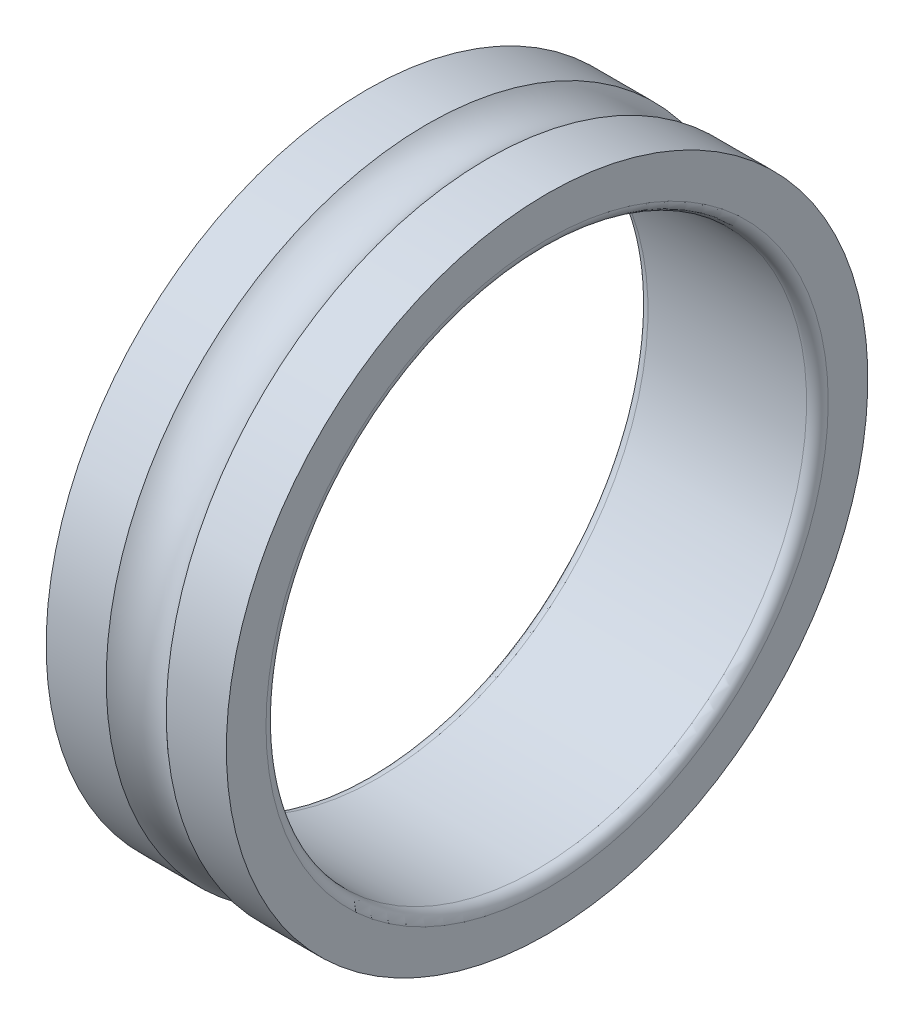
ISO-10303-21;
HEADER;
FILE_DESCRIPTION(('STEP AP214'),'2;1');
FILE_NAME('part.step','',(''),(''),'','','');
FILE_SCHEMA(('AUTOMOTIVE_DESIGN { 1 0 10303 214 1 1 1 1 }'));
ENDSEC;
DATA;
#1=APPLICATION_CONTEXT('core data for automotive mechanical design processes');
#2=APPLICATION_PROTOCOL_DEFINITION('international standard','automotive_design',2000,#1);
#3=PRODUCT_CONTEXT('',#1,'mechanical');
#4=PRODUCT('Part','Part','',(#3));
#5=PRODUCT_RELATED_PRODUCT_CATEGORY('part','',(#4));
#6=PRODUCT_DEFINITION_FORMATION('','',#4);
#7=PRODUCT_DEFINITION_CONTEXT('part definition',#1,'design');
#8=PRODUCT_DEFINITION('design','',#6,#7);
#9=PRODUCT_DEFINITION_SHAPE('','',#8);
#10=(LENGTH_UNIT() NAMED_UNIT(*) SI_UNIT(.MILLI.,.METRE.));
#11=(NAMED_UNIT(*) PLANE_ANGLE_UNIT() SI_UNIT($,.RADIAN.));
#12=(NAMED_UNIT(*) SI_UNIT($,.STERADIAN.) SOLID_ANGLE_UNIT());
#13=UNCERTAINTY_MEASURE_WITH_UNIT(LENGTH_MEASURE(1.E-05),#10,'distance_accuracy_value','');
#14=(GEOMETRIC_REPRESENTATION_CONTEXT(3) GLOBAL_UNCERTAINTY_ASSIGNED_CONTEXT((#13)) GLOBAL_UNIT_ASSIGNED_CONTEXT((#10,
#11,#12)) REPRESENTATION_CONTEXT('',''));
#15=CARTESIAN_POINT('',(0.,0.,0.));
#16=DIRECTION('',(0.,0.,1.));
#17=DIRECTION('',(1.,0.,0.));
#18=AXIS2_PLACEMENT_3D('',#15,#16,#17);
#19=CARTESIAN_POINT('',(4.16677039542175,0.,0.));
#20=DIRECTION('',(-1.,0.,0.));
#21=DIRECTION('',(0.,1.,0.));
#22=AXIS2_PLACEMENT_3D('',#19,#20,#21);
#23=CYLINDRICAL_SURFACE('',#22,8.9);
#24=CARTESIAN_POINT('',(3.3335407908435,0.,0.));
#25=DIRECTION('',(1.,0.,0.));
#26=DIRECTION('',(0.,1.,0.));
#27=AXIS2_PLACEMENT_3D('',#24,#25,#26);
#28=CIRCLE('',#27,8.9);
#29=CARTESIAN_POINT('',(3.3335407908435,8.9,0.));
#30=VERTEX_POINT('',#29);
#31=EDGE_CURVE('E11',#30,#30,#28,.T.);
#32=ORIENTED_EDGE('',*,*,#31,.T.);
#33=EDGE_LOOP('',(#32));
#34=FACE_BOUND('',#33,.T.);
#35=CARTESIAN_POINT('',(5.,0.,0.));
#36=DIRECTION('',(1.,0.,0.));
#37=DIRECTION('',(0.,1.,0.));
#38=AXIS2_PLACEMENT_3D('',#35,#36,#37);
#39=CIRCLE('',#38,8.9);
#40=CARTESIAN_POINT('',(5.,8.9,0.));
#41=VERTEX_POINT('',#40);
#42=EDGE_CURVE('E63',#41,#41,#39,.T.);
#43=ORIENTED_EDGE('',*,*,#42,.F.);
#44=EDGE_LOOP('',(#43));
#45=FACE_BOUND('',#44,.T.);
#46=ADVANCED_FACE('F16',(#34,#45),#23,.T.);
#47=CARTESIAN_POINT('',(2.5,0.,0.));
#48=DIRECTION('',(1.,0.,0.));
#49=DIRECTION('',(0.,0.,-1.));
#50=AXIS2_PLACEMENT_3D('',#47,#48,#49);
#51=TOROIDAL_SURFACE('',#50,9.75,1.1905);
#52=CARTESIAN_POINT('',(1.6664592091565,0.,0.));
#53=DIRECTION('',(1.,0.,0.));
#54=DIRECTION('',(0.,1.,0.));
#55=AXIS2_PLACEMENT_3D('',#52,#53,#54);
#56=CIRCLE('',#55,8.9);
#57=CARTESIAN_POINT('',(1.6664592091565,8.9,0.));
#58=VERTEX_POINT('',#57);
#59=EDGE_CURVE('E26',#58,#58,#56,.T.);
#60=ORIENTED_EDGE('',*,*,#59,.T.);
#61=EDGE_LOOP('',(#60));
#62=FACE_BOUND('',#61,.T.);
#63=ORIENTED_EDGE('',*,*,#31,.F.);
#64=EDGE_LOOP('',(#63));
#65=FACE_BOUND('',#64,.T.);
#66=ADVANCED_FACE('F74',(#62,#65),#51,.F.);
#67=CARTESIAN_POINT('',(0.833229604578252,0.,0.));
#68=DIRECTION('',(-1.,0.,0.));
#69=DIRECTION('',(0.,1.,0.));
#70=AXIS2_PLACEMENT_3D('',#67,#68,#69);
#71=CYLINDRICAL_SURFACE('',#70,8.9);
#72=CARTESIAN_POINT('',(0.,0.,0.));
#73=DIRECTION('',(1.,0.,0.));
#74=DIRECTION('',(0.,1.,0.));
#75=AXIS2_PLACEMENT_3D('',#72,#73,#74);
#76=CIRCLE('',#75,8.9);
#77=CARTESIAN_POINT('',(0.,8.9,0.));
#78=VERTEX_POINT('',#77);
#79=EDGE_CURVE('E45',#78,#78,#76,.T.);
#80=ORIENTED_EDGE('',*,*,#79,.T.);
#81=EDGE_LOOP('',(#80));
#82=FACE_BOUND('',#81,.T.);
#83=ORIENTED_EDGE('',*,*,#59,.F.);
#84=EDGE_LOOP('',(#83));
#85=FACE_BOUND('',#84,.T.);
#86=ADVANCED_FACE('F77',(#82,#85),#71,.T.);
#87=CARTESIAN_POINT('',(0.,8.35,0.));
#88=DIRECTION('',(-1.,0.,0.));
#89=DIRECTION('',(0.,-1.,0.));
#90=AXIS2_PLACEMENT_3D('',#87,#88,#89);
#91=PLANE('',#90);
#92=CARTESIAN_POINT('',(0.,0.,0.));
#93=DIRECTION('',(1.,0.,0.));
#94=DIRECTION('',(0.,1.,0.));
#95=AXIS2_PLACEMENT_3D('',#92,#93,#94);
#96=CIRCLE('',#95,7.8);
#97=CARTESIAN_POINT('',(0.,7.8,0.));
#98=VERTEX_POINT('',#97);
#99=EDGE_CURVE('E49',#98,#98,#96,.T.);
#100=ORIENTED_EDGE('',*,*,#99,.T.);
#101=EDGE_LOOP('',(#100));
#102=FACE_BOUND('',#101,.T.);
#103=ORIENTED_EDGE('',*,*,#79,.F.);
#104=EDGE_LOOP('',(#103));
#105=FACE_BOUND('',#104,.T.);
#106=ADVANCED_FACE('F79',(#102,#105),#91,.T.);
#107=CARTESIAN_POINT('',(0.3,0.,0.));
#108=DIRECTION('',(1.,0.,0.));
#109=DIRECTION('',(0.,0.,-1.));
#110=AXIS2_PLACEMENT_3D('',#107,#108,#109);
#111=TOROIDAL_SURFACE('',#110,7.8,0.3);
#112=CARTESIAN_POINT('',(0.3,0.,0.));
#113=DIRECTION('',(1.,0.,0.));
#114=DIRECTION('',(0.,1.,0.));
#115=AXIS2_PLACEMENT_3D('',#112,#113,#114);
#116=CIRCLE('',#115,7.5);
#117=CARTESIAN_POINT('',(0.3,7.5,0.));
#118=VERTEX_POINT('',#117);
#119=EDGE_CURVE('E54',#118,#118,#116,.T.);
#120=ORIENTED_EDGE('',*,*,#119,.T.);
#121=EDGE_LOOP('',(#120));
#122=FACE_BOUND('',#121,.T.);
#123=ORIENTED_EDGE('',*,*,#99,.F.);
#124=EDGE_LOOP('',(#123));
#125=FACE_BOUND('',#124,.T.);
#126=ADVANCED_FACE('F86',(#122,#125),#111,.T.);
#127=CARTESIAN_POINT('',(2.5,0.,0.));
#128=DIRECTION('',(-1.,0.,0.));
#129=DIRECTION('',(0.,1.,0.));
#130=AXIS2_PLACEMENT_3D('',#127,#128,#129);
#131=CYLINDRICAL_SURFACE('',#130,7.5);
#132=CARTESIAN_POINT('',(4.7,0.,0.));
#133=DIRECTION('',(1.,0.,0.));
#134=DIRECTION('',(0.,1.,0.));
#135=AXIS2_PLACEMENT_3D('',#132,#133,#134);
#136=CIRCLE('',#135,7.5);
#137=CARTESIAN_POINT('',(4.7,7.5,0.));
#138=VERTEX_POINT('',#137);
#139=EDGE_CURVE('E20',#138,#138,#136,.T.);
#140=ORIENTED_EDGE('',*,*,#139,.T.);
#141=EDGE_LOOP('',(#140));
#142=FACE_BOUND('',#141,.T.);
#143=ORIENTED_EDGE('',*,*,#119,.F.);
#144=EDGE_LOOP('',(#143));
#145=FACE_BOUND('',#144,.T.);
#146=ADVANCED_FACE('F95',(#142,#145),#131,.F.);
#147=CARTESIAN_POINT('',(4.7,0.,0.));
#148=DIRECTION('',(1.,0.,0.));
#149=DIRECTION('',(0.,0.,-1.));
#150=AXIS2_PLACEMENT_3D('',#147,#148,#149);
#151=TOROIDAL_SURFACE('',#150,7.8,0.3);
#152=CARTESIAN_POINT('',(5.,0.,0.));
#153=DIRECTION('',(1.,0.,0.));
#154=DIRECTION('',(0.,1.,0.));
#155=AXIS2_PLACEMENT_3D('',#152,#153,#154);
#156=CIRCLE('',#155,7.8);
#157=CARTESIAN_POINT('',(5.,7.8,0.));
#158=VERTEX_POINT('',#157);
#159=EDGE_CURVE('E59',#158,#158,#156,.T.);
#160=ORIENTED_EDGE('',*,*,#159,.T.);
#161=EDGE_LOOP('',(#160));
#162=FACE_BOUND('',#161,.T.);
#163=ORIENTED_EDGE('',*,*,#139,.F.);
#164=EDGE_LOOP('',(#163));
#165=FACE_BOUND('',#164,.T.);
#166=ADVANCED_FACE('F18',(#162,#165),#151,.T.);
#167=CARTESIAN_POINT('',(5.,8.35,0.));
#168=DIRECTION('',(1.,0.,0.));
#169=DIRECTION('',(0.,1.,0.));
#170=AXIS2_PLACEMENT_3D('',#167,#168,#169);
#171=PLANE('',#170);
#172=ORIENTED_EDGE('',*,*,#42,.T.);
#173=EDGE_LOOP('',(#172));
#174=FACE_BOUND('',#173,.T.);
#175=ORIENTED_EDGE('',*,*,#159,.F.);
#176=EDGE_LOOP('',(#175));
#177=FACE_BOUND('',#176,.T.);
#178=ADVANCED_FACE('F64',(#174,#177),#171,.T.);
#179=CLOSED_SHELL('',(#46,#66,#86,#106,#126,#146,#166,#178));
#180=MANIFOLD_SOLID_BREP('B1',#179);
#181=ADVANCED_BREP_SHAPE_REPRESENTATION('',(#18,#180),#14);
#182=SHAPE_DEFINITION_REPRESENTATION(#9,#181);
ENDSEC;
END-ISO-10303-21;
